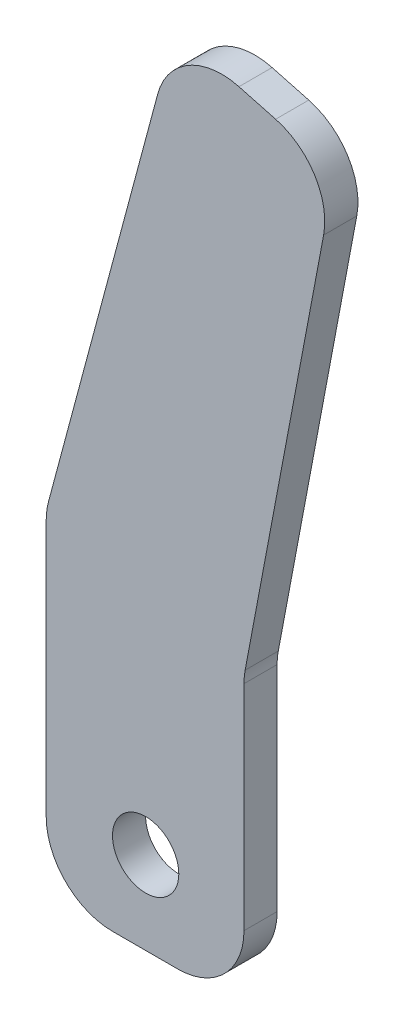
ISO-10303-21;
HEADER;
FILE_DESCRIPTION(('STEP AP214'),'2;1');
FILE_NAME('part.step','',(''),(''),'','','');
FILE_SCHEMA(('AUTOMOTIVE_DESIGN { 1 0 10303 214 1 1 1 1 }'));
ENDSEC;
DATA;
#1=APPLICATION_CONTEXT('core data for automotive mechanical design processes');
#2=APPLICATION_PROTOCOL_DEFINITION('international standard','automotive_design',2000,#1);
#3=PRODUCT_CONTEXT('',#1,'mechanical');
#4=PRODUCT('Part','Part','',(#3));
#5=PRODUCT_RELATED_PRODUCT_CATEGORY('part','',(#4));
#6=PRODUCT_DEFINITION_FORMATION('','',#4);
#7=PRODUCT_DEFINITION_CONTEXT('part definition',#1,'design');
#8=PRODUCT_DEFINITION('design','',#6,#7);
#9=PRODUCT_DEFINITION_SHAPE('','',#8);
#10=(LENGTH_UNIT() NAMED_UNIT(*) SI_UNIT(.MILLI.,.METRE.));
#11=(NAMED_UNIT(*) PLANE_ANGLE_UNIT() SI_UNIT($,.RADIAN.));
#12=(NAMED_UNIT(*) SI_UNIT($,.STERADIAN.) SOLID_ANGLE_UNIT());
#13=UNCERTAINTY_MEASURE_WITH_UNIT(LENGTH_MEASURE(1.E-05),#10,'distance_accuracy_value','');
#14=(GEOMETRIC_REPRESENTATION_CONTEXT(3) GLOBAL_UNCERTAINTY_ASSIGNED_CONTEXT((#13)) GLOBAL_UNIT_ASSIGNED_CONTEXT((#10,
#11,#12)) REPRESENTATION_CONTEXT('',''));
#15=CARTESIAN_POINT('',(0.,0.,0.));
#16=DIRECTION('',(0.,0.,1.));
#17=DIRECTION('',(1.,0.,0.));
#18=AXIS2_PLACEMENT_3D('',#15,#16,#17);
#19=CARTESIAN_POINT('',(0.,0.,1.));
#20=DIRECTION('',(0.,0.,-1.));
#21=DIRECTION('',(-1.,0.,0.));
#22=AXIS2_PLACEMENT_3D('',#19,#20,#21);
#23=PLANE('',#22);
#24=DIRECTION('',(-0.258819045102518,-0.965925826289069,0.));
#25=VECTOR('',#24,1.);
#26=CARTESIAN_POINT('',(0.,10.,1.));
#27=LINE('',#26,#25);
#28=CARTESIAN_POINT('',(3.36464758633273,22.5570357417579,1.));
#29=VERTEX_POINT('',#28);
#30=CARTESIAN_POINT('',(0.0681483474218622,10.2543330950302,1.));
#31=VERTEX_POINT('',#30);
#32=EDGE_CURVE('E135',#29,#31,#27,.T.);
#33=ORIENTED_EDGE('',*,*,#32,.T.);
#34=CARTESIAN_POINT('',(2.,9.73669500482521,1.));
#35=DIRECTION('',(0.,0.,-1.));
#36=DIRECTION('',(-1.,0.,0.));
#37=AXIS2_PLACEMENT_3D('',#34,#35,#36);
#38=CIRCLE('',#37,2.);
#39=CARTESIAN_POINT('',(0.,9.73669500482521,1.));
#40=VERTEX_POINT('',#39);
#41=EDGE_CURVE('E196',#31,#40,#38,.F.);
#42=ORIENTED_EDGE('',*,*,#41,.T.);
#43=DIRECTION('',(0.,-1.,0.));
#44=VECTOR('',#43,1.);
#45=CARTESIAN_POINT('',(0.,0.,1.));
#46=LINE('',#45,#44);
#47=CARTESIAN_POINT('',(0.,2.,1.));
#48=VERTEX_POINT('',#47);
#49=EDGE_CURVE('E153',#40,#48,#46,.T.);
#50=ORIENTED_EDGE('',*,*,#49,.T.);
#51=CARTESIAN_POINT('',(2.,2.,1.));
#52=DIRECTION('',(0.,0.,-1.));
#53=DIRECTION('',(-1.,0.,0.));
#54=AXIS2_PLACEMENT_3D('',#51,#52,#53);
#55=CIRCLE('',#54,2.);
#56=CARTESIAN_POINT('',(2.,0.,1.));
#57=VERTEX_POINT('',#56);
#58=EDGE_CURVE('E167',#48,#57,#55,.F.);
#59=ORIENTED_EDGE('',*,*,#58,.T.);
#60=DIRECTION('',(1.,0.,0.));
#61=VECTOR('',#60,1.);
#62=CARTESIAN_POINT('',(0.,0.,1.));
#63=LINE('',#62,#61);
#64=CARTESIAN_POINT('',(3.96592582628909,0.,1.));
#65=VERTEX_POINT('',#64);
#66=EDGE_CURVE('E239',#57,#65,#63,.T.);
#67=ORIENTED_EDGE('',*,*,#66,.T.);
#68=CARTESIAN_POINT('',(3.96592582628909,2.,1.));
#69=DIRECTION('',(0.,0.,-1.));
#70=DIRECTION('',(-1.,0.,0.));
#71=AXIS2_PLACEMENT_3D('',#68,#69,#70);
#72=CIRCLE('',#71,2.);
#73=CARTESIAN_POINT('',(5.96592582628907,2.00000000000001,1.));
#74=VERTEX_POINT('',#73);
#75=EDGE_CURVE('E156',#65,#74,#72,.F.);
#76=ORIENTED_EDGE('',*,*,#75,.T.);
#77=DIRECTION('',(0.,1.,0.));
#78=VECTOR('',#77,1.);
#79=CARTESIAN_POINT('',(5.96592582628907,0.,1.));
#80=LINE('',#79,#78);
#81=CARTESIAN_POINT('',(5.96592582628907,8.45245385235334,1.));
#82=VERTEX_POINT('',#81);
#83=EDGE_CURVE('E134',#74,#82,#80,.T.);
#84=ORIENTED_EDGE('',*,*,#83,.T.);
#85=CARTESIAN_POINT('',(7.96592582628907,8.45245385235335,1.));
#86=DIRECTION('',(0.,0.,-1.));
#87=DIRECTION('',(-1.,0.,0.));
#88=AXIS2_PLACEMENT_3D('',#85,#86,#87);
#89=CIRCLE('',#88,2.);
#90=CARTESIAN_POINT('',(6.00059515055453,8.82323051695998,1.));
#91=VERTEX_POINT('',#90);
#92=EDGE_CURVE('E11',#82,#91,#89,.T.);
#93=ORIENTED_EDGE('',*,*,#92,.T.);
#94=DIRECTION('',(0.185388332303314,0.98266533786727,0.));
#95=VECTOR('',#94,1.);
#96=CARTESIAN_POINT('',(8.71191480798311,23.1947921688235,1.));
#97=LINE('',#96,#95);
#98=CARTESIAN_POINT('',(8.36806801498833,21.3722053813228,1.));
#99=VERTEX_POINT('',#98);
#100=EDGE_CURVE('E205',#91,#99,#97,.T.);
#101=ORIENTED_EDGE('',*,*,#100,.T.);
#102=CARTESIAN_POINT('',(6.40273733925379,21.7429820459294,1.));
#103=DIRECTION('',(0.,0.,-1.));
#104=DIRECTION('',(-1.,0.,0.));
#105=AXIS2_PLACEMENT_3D('',#102,#103,#104);
#106=CIRCLE('',#105,2.);
#107=CARTESIAN_POINT('',(6.92037542945882,23.6748336985076,1.));
#108=VERTEX_POINT('',#107);
#109=EDGE_CURVE('E178',#99,#108,#106,.F.);
#110=ORIENTED_EDGE('',*,*,#109,.T.);
#111=DIRECTION('',(-0.965925826289069,0.258819045102517,0.));
#112=VECTOR('',#111,1.);
#113=CARTESIAN_POINT('',(3.88228567653777,24.488887394336,1.));
#114=LINE('',#113,#112);
#115=CARTESIAN_POINT('',(5.8141373291159,23.971249304131,1.));
#116=VERTEX_POINT('',#115);
#117=EDGE_CURVE('E219',#108,#116,#114,.T.);
#118=ORIENTED_EDGE('',*,*,#117,.T.);
#119=CARTESIAN_POINT('',(5.29649923891087,22.0393976515529,1.));
#120=DIRECTION('',(0.,0.,-1.));
#121=DIRECTION('',(-1.,0.,0.));
#122=AXIS2_PLACEMENT_3D('',#119,#120,#121);
#123=CIRCLE('',#122,2.);
#124=EDGE_CURVE('E187',#116,#29,#123,.F.);
#125=ORIENTED_EDGE('',*,*,#124,.T.);
#126=EDGE_LOOP('',(#33,#42,#50,#59,#67,#76,#84,#93,#101,#110,#118,#125));
#127=FACE_BOUND('',#126,.T.);
#128=CARTESIAN_POINT('',(2.99979351159563,2.5,1.));
#129=DIRECTION('',(0.,0.,1.));
#130=DIRECTION('',(1.,0.,0.));
#131=AXIS2_PLACEMENT_3D('',#128,#129,#130);
#132=CIRCLE('',#131,1.);
#133=CARTESIAN_POINT('',(3.99979351159563,2.5,1.));
#134=VERTEX_POINT('',#133);
#135=EDGE_CURVE('E228',#134,#134,#132,.T.);
#136=ORIENTED_EDGE('',*,*,#135,.F.);
#137=EDGE_LOOP('',(#136));
#138=FACE_BOUND('',#137,.T.);
#139=ADVANCED_FACE('F33',(#127,#138),#23,.F.);
#140=CARTESIAN_POINT('',(0.,0.,0.));
#141=DIRECTION('',(0.,0.,-1.));
#142=DIRECTION('',(-1.,0.,0.));
#143=AXIS2_PLACEMENT_3D('',#140,#141,#142);
#144=PLANE('',#143);
#145=DIRECTION('',(0.,-1.,0.));
#146=VECTOR('',#145,1.);
#147=CARTESIAN_POINT('',(0.,0.,0.));
#148=LINE('',#147,#146);
#149=CARTESIAN_POINT('',(0.,9.73669500482521,0.));
#150=VERTEX_POINT('',#149);
#151=CARTESIAN_POINT('',(0.,2.,0.));
#152=VERTEX_POINT('',#151);
#153=EDGE_CURVE('E145',#150,#152,#148,.T.);
#154=ORIENTED_EDGE('',*,*,#153,.F.);
#155=CARTESIAN_POINT('',(2.,9.73669500482521,0.));
#156=DIRECTION('',(0.,0.,-1.));
#157=DIRECTION('',(-1.,0.,0.));
#158=AXIS2_PLACEMENT_3D('',#155,#156,#157);
#159=CIRCLE('',#158,2.);
#160=CARTESIAN_POINT('',(0.0681483474218622,10.2543330950302,0.));
#161=VERTEX_POINT('',#160);
#162=EDGE_CURVE('E192',#150,#161,#159,.T.);
#163=ORIENTED_EDGE('',*,*,#162,.T.);
#164=DIRECTION('',(-0.258819045102518,-0.965925826289069,0.));
#165=VECTOR('',#164,1.);
#166=CARTESIAN_POINT('',(0.,10.,0.));
#167=LINE('',#166,#165);
#168=CARTESIAN_POINT('',(3.36464758633273,22.5570357417579,0.));
#169=VERTEX_POINT('',#168);
#170=EDGE_CURVE('E151',#169,#161,#167,.T.);
#171=ORIENTED_EDGE('',*,*,#170,.F.);
#172=CARTESIAN_POINT('',(5.29649923891087,22.0393976515529,0.));
#173=DIRECTION('',(0.,0.,-1.));
#174=DIRECTION('',(-1.,0.,0.));
#175=AXIS2_PLACEMENT_3D('',#172,#173,#174);
#176=CIRCLE('',#175,2.);
#177=CARTESIAN_POINT('',(5.8141373291159,23.971249304131,0.));
#178=VERTEX_POINT('',#177);
#179=EDGE_CURVE('E183',#169,#178,#176,.T.);
#180=ORIENTED_EDGE('',*,*,#179,.T.);
#181=DIRECTION('',(-0.965925826289069,0.258819045102517,0.));
#182=VECTOR('',#181,1.);
#183=CARTESIAN_POINT('',(3.88228567653777,24.488887394336,0.));
#184=LINE('',#183,#182);
#185=CARTESIAN_POINT('',(6.92037542945882,23.6748336985076,0.));
#186=VERTEX_POINT('',#185);
#187=EDGE_CURVE('E143',#186,#178,#184,.T.);
#188=ORIENTED_EDGE('',*,*,#187,.F.);
#189=CARTESIAN_POINT('',(6.40273733925379,21.7429820459294,0.));
#190=DIRECTION('',(0.,0.,-1.));
#191=DIRECTION('',(-1.,0.,0.));
#192=AXIS2_PLACEMENT_3D('',#189,#190,#191);
#193=CIRCLE('',#192,2.);
#194=CARTESIAN_POINT('',(8.36806801498833,21.3722053813228,0.));
#195=VERTEX_POINT('',#194);
#196=EDGE_CURVE('E172',#186,#195,#193,.T.);
#197=ORIENTED_EDGE('',*,*,#196,.T.);
#198=DIRECTION('',(0.185388332303314,0.98266533786727,0.));
#199=VECTOR('',#198,1.);
#200=CARTESIAN_POINT('',(8.71191480798311,23.1947921688235,0.));
#201=LINE('',#200,#199);
#202=CARTESIAN_POINT('',(6.00059515055453,8.82323051695998,0.));
#203=VERTEX_POINT('',#202);
#204=EDGE_CURVE('E140',#203,#195,#201,.T.);
#205=ORIENTED_EDGE('',*,*,#204,.F.);
#206=CARTESIAN_POINT('',(7.96592582628907,8.45245385235335,0.));
#207=DIRECTION('',(0.,0.,-1.));
#208=DIRECTION('',(-1.,0.,0.));
#209=AXIS2_PLACEMENT_3D('',#206,#207,#208);
#210=CIRCLE('',#209,2.);
#211=CARTESIAN_POINT('',(5.96592582628907,8.45245385235334,0.));
#212=VERTEX_POINT('',#211);
#213=EDGE_CURVE('E41',#203,#212,#210,.F.);
#214=ORIENTED_EDGE('',*,*,#213,.T.);
#215=DIRECTION('',(0.,1.,0.));
#216=VECTOR('',#215,1.);
#217=CARTESIAN_POINT('',(5.96592582628907,8.63946305533133,0.));
#218=LINE('',#217,#216);
#219=CARTESIAN_POINT('',(5.96592582628909,2.00000000000001,0.));
#220=VERTEX_POINT('',#219);
#221=EDGE_CURVE('E133',#220,#212,#218,.T.);
#222=ORIENTED_EDGE('',*,*,#221,.F.);
#223=CARTESIAN_POINT('',(3.96592582628909,2.,0.));
#224=DIRECTION('',(0.,0.,-1.));
#225=DIRECTION('',(-1.,0.,0.));
#226=AXIS2_PLACEMENT_3D('',#223,#224,#225);
#227=CIRCLE('',#226,2.);
#228=CARTESIAN_POINT('',(3.96592582628909,0.,0.));
#229=VERTEX_POINT('',#228);
#230=EDGE_CURVE('E123',#220,#229,#227,.T.);
#231=ORIENTED_EDGE('',*,*,#230,.T.);
#232=DIRECTION('',(1.,0.,0.));
#233=VECTOR('',#232,1.);
#234=CARTESIAN_POINT('',(0.,0.,0.));
#235=LINE('',#234,#233);
#236=CARTESIAN_POINT('',(2.,0.,0.));
#237=VERTEX_POINT('',#236);
#238=EDGE_CURVE('E141',#237,#229,#235,.T.);
#239=ORIENTED_EDGE('',*,*,#238,.F.);
#240=CARTESIAN_POINT('',(2.,2.,0.));
#241=DIRECTION('',(0.,0.,-1.));
#242=DIRECTION('',(-1.,0.,0.));
#243=AXIS2_PLACEMENT_3D('',#240,#241,#242);
#244=CIRCLE('',#243,2.);
#245=EDGE_CURVE('E161',#237,#152,#244,.T.);
#246=ORIENTED_EDGE('',*,*,#245,.T.);
#247=EDGE_LOOP('',(#154,#163,#171,#180,#188,#197,#205,#214,#222,#231,#239,#246));
#248=FACE_BOUND('',#247,.T.);
#249=CARTESIAN_POINT('',(2.99979351159563,2.5,0.));
#250=DIRECTION('',(0.,0.,1.));
#251=DIRECTION('',(1.,0.,0.));
#252=AXIS2_PLACEMENT_3D('',#249,#250,#251);
#253=CIRCLE('',#252,1.);
#254=CARTESIAN_POINT('',(3.99979351159563,2.5,0.));
#255=VERTEX_POINT('',#254);
#256=EDGE_CURVE('E231',#255,#255,#253,.T.);
#257=ORIENTED_EDGE('',*,*,#256,.T.);
#258=EDGE_LOOP('',(#257));
#259=FACE_BOUND('',#258,.T.);
#260=ADVANCED_FACE('F138',(#248,#259),#144,.T.);
#261=CARTESIAN_POINT('',(0.,0.,1.));
#262=DIRECTION('',(1.,0.,0.));
#263=DIRECTION('',(0.,0.,-1.));
#264=AXIS2_PLACEMENT_3D('',#261,#262,#263);
#265=PLANE('',#264);
#266=ORIENTED_EDGE('',*,*,#49,.F.);
#267=DIRECTION('',(0.,0.,-1.));
#268=VECTOR('',#267,1.);
#269=CARTESIAN_POINT('',(0.,9.73669500482521,1.));
#270=LINE('',#269,#268);
#271=EDGE_CURVE('E189',#40,#150,#270,.T.);
#272=ORIENTED_EDGE('',*,*,#271,.T.);
#273=ORIENTED_EDGE('',*,*,#153,.T.);
#274=DIRECTION('',(0.,0.,-1.));
#275=VECTOR('',#274,1.);
#276=CARTESIAN_POINT('',(0.,2.,1.));
#277=LINE('',#276,#275);
#278=EDGE_CURVE('E164',#152,#48,#277,.F.);
#279=ORIENTED_EDGE('',*,*,#278,.T.);
#280=EDGE_LOOP('',(#266,#272,#273,#279));
#281=FACE_BOUND('',#280,.T.);
#282=ADVANCED_FACE('F252',(#281),#265,.F.);
#283=CARTESIAN_POINT('',(0.,0.,1.));
#284=DIRECTION('',(0.,1.,0.));
#285=DIRECTION('',(0.,0.,1.));
#286=AXIS2_PLACEMENT_3D('',#283,#284,#285);
#287=PLANE('',#286);
#288=ORIENTED_EDGE('',*,*,#66,.F.);
#289=DIRECTION('',(0.,0.,-1.));
#290=VECTOR('',#289,1.);
#291=CARTESIAN_POINT('',(2.,0.,1.));
#292=LINE('',#291,#290);
#293=EDGE_CURVE('E158',#57,#237,#292,.T.);
#294=ORIENTED_EDGE('',*,*,#293,.T.);
#295=ORIENTED_EDGE('',*,*,#238,.T.);
#296=DIRECTION('',(0.,0.,-1.));
#297=VECTOR('',#296,1.);
#298=CARTESIAN_POINT('',(3.96592582628909,0.,1.));
#299=LINE('',#298,#297);
#300=EDGE_CURVE('E129',#229,#65,#299,.F.);
#301=ORIENTED_EDGE('',*,*,#300,.T.);
#302=EDGE_LOOP('',(#288,#294,#295,#301));
#303=FACE_BOUND('',#302,.T.);
#304=ADVANCED_FACE('F267',(#303),#287,.F.);
#305=CARTESIAN_POINT('',(5.96592582628907,8.63946305533133,1.));
#306=DIRECTION('',(-1.,0.,0.));
#307=DIRECTION('',(0.,-1.,0.));
#308=AXIS2_PLACEMENT_3D('',#305,#306,#307);
#309=PLANE('',#308);
#310=ORIENTED_EDGE('',*,*,#221,.T.);
#311=DIRECTION('',(0.,0.,-1.));
#312=VECTOR('',#311,1.);
#313=CARTESIAN_POINT('',(5.96592582628907,8.45245385235334,1.));
#314=LINE('',#313,#312);
#315=EDGE_CURVE('E54',#212,#82,#314,.F.);
#316=ORIENTED_EDGE('',*,*,#315,.T.);
#317=ORIENTED_EDGE('',*,*,#83,.F.);
#318=DIRECTION('',(0.,0.,-1.));
#319=VECTOR('',#318,1.);
#320=CARTESIAN_POINT('',(5.96592582628909,2.00000000000001,1.));
#321=LINE('',#320,#319);
#322=EDGE_CURVE('E127',#74,#220,#321,.T.);
#323=ORIENTED_EDGE('',*,*,#322,.T.);
#324=EDGE_LOOP('',(#310,#316,#317,#323));
#325=FACE_BOUND('',#324,.T.);
#326=ADVANCED_FACE('F132',(#325),#309,.F.);
#327=CARTESIAN_POINT('',(8.71191480798311,23.1947921688235,1.));
#328=DIRECTION('',(-0.98266533786727,0.185388332303314,0.));
#329=DIRECTION('',(-0.185388332303314,-0.98266533786727,0.));
#330=AXIS2_PLACEMENT_3D('',#327,#328,#329);
#331=PLANE('',#330);
#332=ORIENTED_EDGE('',*,*,#100,.F.);
#333=DIRECTION('',(0.,0.,-1.));
#334=VECTOR('',#333,1.);
#335=CARTESIAN_POINT('',(6.00059515055453,8.82323051695998,0.));
#336=LINE('',#335,#334);
#337=EDGE_CURVE('E198',#91,#203,#336,.T.);
#338=ORIENTED_EDGE('',*,*,#337,.T.);
#339=ORIENTED_EDGE('',*,*,#204,.T.);
#340=DIRECTION('',(0.,0.,-1.));
#341=VECTOR('',#340,1.);
#342=CARTESIAN_POINT('',(8.36806801498833,21.3722053813228,1.));
#343=LINE('',#342,#341);
#344=EDGE_CURVE('E175',#195,#99,#343,.F.);
#345=ORIENTED_EDGE('',*,*,#344,.T.);
#346=EDGE_LOOP('',(#332,#338,#339,#345));
#347=FACE_BOUND('',#346,.T.);
#348=ADVANCED_FACE('F204',(#347),#331,.F.);
#349=CARTESIAN_POINT('',(3.88228567653777,24.488887394336,1.));
#350=DIRECTION('',(-0.258819045102517,-0.965925826289069,0.));
#351=DIRECTION('',(0.965925826289069,-0.258819045102517,0.));
#352=AXIS2_PLACEMENT_3D('',#349,#350,#351);
#353=PLANE('',#352);
#354=ORIENTED_EDGE('',*,*,#187,.T.);
#355=DIRECTION('',(0.,0.,-1.));
#356=VECTOR('',#355,1.);
#357=CARTESIAN_POINT('',(5.8141373291159,23.971249304131,1.));
#358=LINE('',#357,#356);
#359=EDGE_CURVE('E185',#178,#116,#358,.F.);
#360=ORIENTED_EDGE('',*,*,#359,.T.);
#361=ORIENTED_EDGE('',*,*,#117,.F.);
#362=DIRECTION('',(0.,0.,-1.));
#363=VECTOR('',#362,1.);
#364=CARTESIAN_POINT('',(6.92037542945882,23.6748336985076,1.));
#365=LINE('',#364,#363);
#366=EDGE_CURVE('E169',#108,#186,#365,.T.);
#367=ORIENTED_EDGE('',*,*,#366,.T.);
#368=EDGE_LOOP('',(#354,#360,#361,#367));
#369=FACE_BOUND('',#368,.T.);
#370=ADVANCED_FACE('F222',(#369),#353,.F.);
#371=CARTESIAN_POINT('',(0.,10.,1.));
#372=DIRECTION('',(0.965925826289069,-0.258819045102518,0.));
#373=DIRECTION('',(0.258819045102518,0.965925826289069,0.));
#374=AXIS2_PLACEMENT_3D('',#371,#372,#373);
#375=PLANE('',#374);
#376=ORIENTED_EDGE('',*,*,#170,.T.);
#377=DIRECTION('',(0.,0.,-1.));
#378=VECTOR('',#377,1.);
#379=CARTESIAN_POINT('',(0.0681483474218622,10.2543330950302,1.));
#380=LINE('',#379,#378);
#381=EDGE_CURVE('E194',#161,#31,#380,.F.);
#382=ORIENTED_EDGE('',*,*,#381,.T.);
#383=ORIENTED_EDGE('',*,*,#32,.F.);
#384=DIRECTION('',(0.,0.,-1.));
#385=VECTOR('',#384,1.);
#386=CARTESIAN_POINT('',(3.36464758633273,22.5570357417579,1.));
#387=LINE('',#386,#385);
#388=EDGE_CURVE('E180',#29,#169,#387,.T.);
#389=ORIENTED_EDGE('',*,*,#388,.T.);
#390=EDGE_LOOP('',(#376,#382,#383,#389));
#391=FACE_BOUND('',#390,.T.);
#392=ADVANCED_FACE('F257',(#391),#375,.F.);
#393=CARTESIAN_POINT('',(2.99979351159563,2.5,1.));
#394=DIRECTION('',(0.,0.,-1.));
#395=DIRECTION('',(-1.,0.,0.));
#396=AXIS2_PLACEMENT_3D('',#393,#394,#395);
#397=CYLINDRICAL_SURFACE('',#396,1.);
#398=ORIENTED_EDGE('',*,*,#135,.T.);
#399=EDGE_LOOP('',(#398));
#400=FACE_BOUND('',#399,.T.);
#401=ORIENTED_EDGE('',*,*,#256,.F.);
#402=EDGE_LOOP('',(#401));
#403=FACE_BOUND('',#402,.T.);
#404=ADVANCED_FACE('F255',(#400,#403),#397,.F.);
#405=CARTESIAN_POINT('',(3.96592582628909,2.,1.));
#406=DIRECTION('',(0.,0.,-1.));
#407=DIRECTION('',(-1.,0.,0.));
#408=AXIS2_PLACEMENT_3D('',#405,#406,#407);
#409=CYLINDRICAL_SURFACE('',#408,2.);
#410=ORIENTED_EDGE('',*,*,#75,.F.);
#411=ORIENTED_EDGE('',*,*,#300,.F.);
#412=ORIENTED_EDGE('',*,*,#230,.F.);
#413=ORIENTED_EDGE('',*,*,#322,.F.);
#414=EDGE_LOOP('',(#410,#411,#412,#413));
#415=FACE_BOUND('',#414,.T.);
#416=ADVANCED_FACE('F126',(#415),#409,.T.);
#417=CARTESIAN_POINT('',(2.,2.,1.));
#418=DIRECTION('',(0.,0.,-1.));
#419=DIRECTION('',(-1.,0.,0.));
#420=AXIS2_PLACEMENT_3D('',#417,#418,#419);
#421=CYLINDRICAL_SURFACE('',#420,2.);
#422=ORIENTED_EDGE('',*,*,#58,.F.);
#423=ORIENTED_EDGE('',*,*,#278,.F.);
#424=ORIENTED_EDGE('',*,*,#245,.F.);
#425=ORIENTED_EDGE('',*,*,#293,.F.);
#426=EDGE_LOOP('',(#422,#423,#424,#425));
#427=FACE_BOUND('',#426,.T.);
#428=ADVANCED_FACE('F275',(#427),#421,.T.);
#429=CARTESIAN_POINT('',(6.40273733925379,21.7429820459294,1.));
#430=DIRECTION('',(0.,0.,-1.));
#431=DIRECTION('',(-1.,0.,0.));
#432=AXIS2_PLACEMENT_3D('',#429,#430,#431);
#433=CYLINDRICAL_SURFACE('',#432,2.);
#434=ORIENTED_EDGE('',*,*,#109,.F.);
#435=ORIENTED_EDGE('',*,*,#344,.F.);
#436=ORIENTED_EDGE('',*,*,#196,.F.);
#437=ORIENTED_EDGE('',*,*,#366,.F.);
#438=EDGE_LOOP('',(#434,#435,#436,#437));
#439=FACE_BOUND('',#438,.T.);
#440=ADVANCED_FACE('F213',(#439),#433,.T.);
#441=CARTESIAN_POINT('',(5.29649923891087,22.0393976515529,1.));
#442=DIRECTION('',(0.,0.,-1.));
#443=DIRECTION('',(-1.,0.,0.));
#444=AXIS2_PLACEMENT_3D('',#441,#442,#443);
#445=CYLINDRICAL_SURFACE('',#444,2.);
#446=ORIENTED_EDGE('',*,*,#124,.F.);
#447=ORIENTED_EDGE('',*,*,#359,.F.);
#448=ORIENTED_EDGE('',*,*,#179,.F.);
#449=ORIENTED_EDGE('',*,*,#388,.F.);
#450=EDGE_LOOP('',(#446,#447,#448,#449));
#451=FACE_BOUND('',#450,.T.);
#452=ADVANCED_FACE('F245',(#451),#445,.T.);
#453=CARTESIAN_POINT('',(2.,9.73669500482521,1.));
#454=DIRECTION('',(0.,0.,-1.));
#455=DIRECTION('',(-1.,0.,0.));
#456=AXIS2_PLACEMENT_3D('',#453,#454,#455);
#457=CYLINDRICAL_SURFACE('',#456,2.);
#458=ORIENTED_EDGE('',*,*,#41,.F.);
#459=ORIENTED_EDGE('',*,*,#381,.F.);
#460=ORIENTED_EDGE('',*,*,#162,.F.);
#461=ORIENTED_EDGE('',*,*,#271,.F.);
#462=EDGE_LOOP('',(#458,#459,#460,#461));
#463=FACE_BOUND('',#462,.T.);
#464=ADVANCED_FACE('F241',(#463),#457,.T.);
#465=CARTESIAN_POINT('',(7.96592582628907,8.45245385235335,1.));
#466=DIRECTION('',(0.,0.,1.));
#467=DIRECTION('',(1.,0.,0.));
#468=AXIS2_PLACEMENT_3D('',#465,#466,#467);
#469=CYLINDRICAL_SURFACE('',#468,2.);
#470=ORIENTED_EDGE('',*,*,#92,.F.);
#471=ORIENTED_EDGE('',*,*,#315,.F.);
#472=ORIENTED_EDGE('',*,*,#213,.F.);
#473=ORIENTED_EDGE('',*,*,#337,.F.);
#474=EDGE_LOOP('',(#470,#471,#472,#473));
#475=FACE_BOUND('',#474,.T.);
#476=ADVANCED_FACE('F35',(#475),#469,.F.);
#477=CLOSED_SHELL('',(#139,#260,#282,#304,#326,#348,#370,#392,#404,#416,#428,#440,#452,#464,#476));
#478=MANIFOLD_SOLID_BREP('B2',#477);
#479=ADVANCED_BREP_SHAPE_REPRESENTATION('',(#18,#478),#14);
#480=SHAPE_DEFINITION_REPRESENTATION(#9,#479);
ENDSEC;
END-ISO-10303-21;
